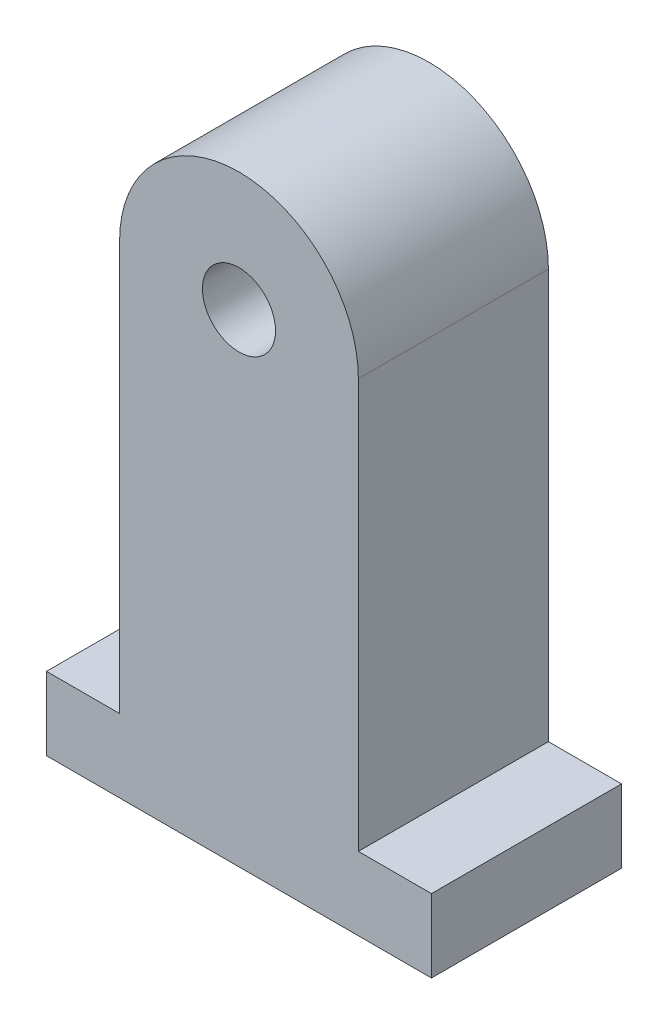
ISO-10303-21;
HEADER;
FILE_DESCRIPTION(('STEP AP214'),'2;1');
FILE_NAME('part.step','',(''),(''),'','','');
FILE_SCHEMA(('AUTOMOTIVE_DESIGN { 1 0 10303 214 1 1 1 1 }'));
ENDSEC;
DATA;
#1=APPLICATION_CONTEXT('core data for automotive mechanical design processes');
#2=APPLICATION_PROTOCOL_DEFINITION('international standard','automotive_design',2000,#1);
#3=PRODUCT_CONTEXT('',#1,'mechanical');
#4=PRODUCT('Part','Part','',(#3));
#5=PRODUCT_RELATED_PRODUCT_CATEGORY('part','',(#4));
#6=PRODUCT_DEFINITION_FORMATION('','',#4);
#7=PRODUCT_DEFINITION_CONTEXT('part definition',#1,'design');
#8=PRODUCT_DEFINITION('design','',#6,#7);
#9=PRODUCT_DEFINITION_SHAPE('','',#8);
#10=(LENGTH_UNIT() NAMED_UNIT(*) SI_UNIT(.MILLI.,.METRE.));
#11=(NAMED_UNIT(*) PLANE_ANGLE_UNIT() SI_UNIT($,.RADIAN.));
#12=(NAMED_UNIT(*) SI_UNIT($,.STERADIAN.) SOLID_ANGLE_UNIT());
#13=UNCERTAINTY_MEASURE_WITH_UNIT(LENGTH_MEASURE(1.E-05),#10,'distance_accuracy_value','');
#14=(GEOMETRIC_REPRESENTATION_CONTEXT(3) GLOBAL_UNCERTAINTY_ASSIGNED_CONTEXT((#13)) GLOBAL_UNIT_ASSIGNED_CONTEXT((#10,
#11,#12)) REPRESENTATION_CONTEXT('',''));
#15=CARTESIAN_POINT('',(0.,0.,0.));
#16=DIRECTION('',(0.,0.,1.));
#17=DIRECTION('',(1.,0.,0.));
#18=AXIS2_PLACEMENT_3D('',#15,#16,#17);
#19=CARTESIAN_POINT('',(0.,25.146,4.953));
#20=DIRECTION('',(0.,0.,-1.));
#21=DIRECTION('',(-1.,0.,0.));
#22=AXIS2_PLACEMENT_3D('',#19,#20,#21);
#23=PLANE('',#22);
#24=DIRECTION('',(0.,-1.,0.));
#25=VECTOR('',#24,1.);
#26=CARTESIAN_POINT('',(-10.033,0.,4.953));
#27=LINE('',#26,#25);
#28=CARTESIAN_POINT('',(-10.033,3.81,4.953));
#29=VERTEX_POINT('',#28);
#30=CARTESIAN_POINT('',(-10.033,0.,4.953));
#31=VERTEX_POINT('',#30);
#32=EDGE_CURVE('E149',#29,#31,#27,.T.);
#33=ORIENTED_EDGE('',*,*,#32,.T.);
#34=DIRECTION('',(1.,0.,0.));
#35=VECTOR('',#34,1.);
#36=CARTESIAN_POINT('',(10.033,0.,4.953));
#37=LINE('',#36,#35);
#38=CARTESIAN_POINT('',(10.033,0.,4.953));
#39=VERTEX_POINT('',#38);
#40=EDGE_CURVE('E97',#31,#39,#37,.T.);
#41=ORIENTED_EDGE('',*,*,#40,.T.);
#42=DIRECTION('',(0.,1.,0.));
#43=VECTOR('',#42,1.);
#44=CARTESIAN_POINT('',(10.033,0.,4.953));
#45=LINE('',#44,#43);
#46=CARTESIAN_POINT('',(10.033,3.81,4.953));
#47=VERTEX_POINT('',#46);
#48=EDGE_CURVE('E164',#39,#47,#45,.T.);
#49=ORIENTED_EDGE('',*,*,#48,.T.);
#50=DIRECTION('',(-1.,0.,0.));
#51=VECTOR('',#50,1.);
#52=CARTESIAN_POINT('',(10.033,3.81,4.953));
#53=LINE('',#52,#51);
#54=CARTESIAN_POINT('',(6.223,3.81,4.953));
#55=VERTEX_POINT('',#54);
#56=EDGE_CURVE('E177',#47,#55,#53,.T.);
#57=ORIENTED_EDGE('',*,*,#56,.T.);
#58=DIRECTION('',(0.,1.,0.));
#59=VECTOR('',#58,1.);
#60=CARTESIAN_POINT('',(6.223,3.81,4.953));
#61=LINE('',#60,#59);
#62=CARTESIAN_POINT('',(6.223,25.146,4.953));
#63=VERTEX_POINT('',#62);
#64=EDGE_CURVE('E116',#55,#63,#61,.T.);
#65=ORIENTED_EDGE('',*,*,#64,.T.);
#66=CARTESIAN_POINT('',(0.,25.146,4.953));
#67=DIRECTION('',(0.,0.,1.));
#68=DIRECTION('',(-1.,0.,0.));
#69=AXIS2_PLACEMENT_3D('',#66,#67,#68);
#70=CIRCLE('',#69,6.223);
#71=CARTESIAN_POINT('',(-6.223,25.146,4.953));
#72=VERTEX_POINT('',#71);
#73=EDGE_CURVE('E110',#63,#72,#70,.T.);
#74=ORIENTED_EDGE('',*,*,#73,.T.);
#75=DIRECTION('',(0.,-1.,0.));
#76=VECTOR('',#75,1.);
#77=CARTESIAN_POINT('',(-6.223,3.81,4.953));
#78=LINE('',#77,#76);
#79=CARTESIAN_POINT('',(-6.223,3.81,4.953));
#80=VERTEX_POINT('',#79);
#81=EDGE_CURVE('E114',#72,#80,#78,.T.);
#82=ORIENTED_EDGE('',*,*,#81,.T.);
#83=DIRECTION('',(-1.,0.,0.));
#84=VECTOR('',#83,1.);
#85=CARTESIAN_POINT('',(-10.033,3.81,4.953));
#86=LINE('',#85,#84);
#87=EDGE_CURVE('E54',#80,#29,#86,.T.);
#88=ORIENTED_EDGE('',*,*,#87,.T.);
#89=EDGE_LOOP('',(#33,#41,#49,#57,#65,#74,#82,#88));
#90=FACE_BOUND('',#89,.T.);
#91=CARTESIAN_POINT('',(0.,25.146,4.953));
#92=DIRECTION('',(0.,0.,1.));
#93=DIRECTION('',(1.,0.,0.));
#94=AXIS2_PLACEMENT_3D('',#91,#92,#93);
#95=CIRCLE('',#94,1.905);
#96=CARTESIAN_POINT('',(1.905,25.146,4.953));
#97=VERTEX_POINT('',#96);
#98=EDGE_CURVE('E138',#97,#97,#95,.T.);
#99=ORIENTED_EDGE('',*,*,#98,.F.);
#100=EDGE_LOOP('',(#99));
#101=FACE_BOUND('',#100,.T.);
#102=ADVANCED_FACE('F37',(#90,#101),#23,.F.);
#103=CARTESIAN_POINT('',(0.,25.146,-4.953));
#104=DIRECTION('',(0.,0.,-1.));
#105=DIRECTION('',(-1.,0.,0.));
#106=AXIS2_PLACEMENT_3D('',#103,#104,#105);
#107=PLANE('',#106);
#108=DIRECTION('',(0.,-1.,0.));
#109=VECTOR('',#108,1.);
#110=CARTESIAN_POINT('',(-10.033,0.,-4.953));
#111=LINE('',#110,#109);
#112=CARTESIAN_POINT('',(-10.033,3.81,-4.953));
#113=VERTEX_POINT('',#112);
#114=CARTESIAN_POINT('',(-10.033,0.,-4.953));
#115=VERTEX_POINT('',#114);
#116=EDGE_CURVE('E134',#113,#115,#111,.T.);
#117=ORIENTED_EDGE('',*,*,#116,.F.);
#118=DIRECTION('',(-1.,0.,0.));
#119=VECTOR('',#118,1.);
#120=CARTESIAN_POINT('',(-10.033,3.81,-4.953));
#121=LINE('',#120,#119);
#122=CARTESIAN_POINT('',(-6.223,3.81,-4.953));
#123=VERTEX_POINT('',#122);
#124=EDGE_CURVE('E89',#123,#113,#121,.T.);
#125=ORIENTED_EDGE('',*,*,#124,.F.);
#126=DIRECTION('',(0.,-1.,0.));
#127=VECTOR('',#126,1.);
#128=CARTESIAN_POINT('',(-6.223,3.81,-4.953));
#129=LINE('',#128,#127);
#130=CARTESIAN_POINT('',(-6.223,25.146,-4.953));
#131=VERTEX_POINT('',#130);
#132=EDGE_CURVE('E83',#131,#123,#129,.T.);
#133=ORIENTED_EDGE('',*,*,#132,.F.);
#134=CARTESIAN_POINT('',(0.,25.146,-4.953));
#135=DIRECTION('',(0.,0.,1.));
#136=DIRECTION('',(-1.,0.,0.));
#137=AXIS2_PLACEMENT_3D('',#134,#135,#136);
#138=CIRCLE('',#137,6.223);
#139=CARTESIAN_POINT('',(6.223,25.146,-4.953));
#140=VERTEX_POINT('',#139);
#141=EDGE_CURVE('E124',#140,#131,#138,.T.);
#142=ORIENTED_EDGE('',*,*,#141,.F.);
#143=DIRECTION('',(0.,1.,0.));
#144=VECTOR('',#143,1.);
#145=CARTESIAN_POINT('',(6.223,3.81,-4.953));
#146=LINE('',#145,#144);
#147=CARTESIAN_POINT('',(6.223,3.81,-4.953));
#148=VERTEX_POINT('',#147);
#149=EDGE_CURVE('E144',#148,#140,#146,.T.);
#150=ORIENTED_EDGE('',*,*,#149,.F.);
#151=DIRECTION('',(-1.,0.,0.));
#152=VECTOR('',#151,1.);
#153=CARTESIAN_POINT('',(10.033,3.81,-4.953));
#154=LINE('',#153,#152);
#155=CARTESIAN_POINT('',(10.033,3.81,-4.953));
#156=VERTEX_POINT('',#155);
#157=EDGE_CURVE('E142',#156,#148,#154,.T.);
#158=ORIENTED_EDGE('',*,*,#157,.F.);
#159=DIRECTION('',(0.,1.,0.));
#160=VECTOR('',#159,1.);
#161=CARTESIAN_POINT('',(10.033,0.,-4.953));
#162=LINE('',#161,#160);
#163=CARTESIAN_POINT('',(10.033,0.,-4.953));
#164=VERTEX_POINT('',#163);
#165=EDGE_CURVE('E140',#164,#156,#162,.T.);
#166=ORIENTED_EDGE('',*,*,#165,.F.);
#167=DIRECTION('',(1.,0.,0.));
#168=VECTOR('',#167,1.);
#169=CARTESIAN_POINT('',(10.033,0.,-4.953));
#170=LINE('',#169,#168);
#171=EDGE_CURVE('E137',#115,#164,#170,.T.);
#172=ORIENTED_EDGE('',*,*,#171,.F.);
#173=EDGE_LOOP('',(#117,#125,#133,#142,#150,#158,#166,#172));
#174=FACE_BOUND('',#173,.T.);
#175=CARTESIAN_POINT('',(0.,25.146,-4.953));
#176=DIRECTION('',(0.,0.,1.));
#177=DIRECTION('',(1.,0.,0.));
#178=AXIS2_PLACEMENT_3D('',#175,#176,#177);
#179=CIRCLE('',#178,1.905);
#180=CARTESIAN_POINT('',(1.905,25.146,-4.953));
#181=VERTEX_POINT('',#180);
#182=EDGE_CURVE('E183',#181,#181,#179,.T.);
#183=ORIENTED_EDGE('',*,*,#182,.T.);
#184=EDGE_LOOP('',(#183));
#185=FACE_BOUND('',#184,.T.);
#186=ADVANCED_FACE('F168',(#174,#185),#107,.T.);
#187=CARTESIAN_POINT('',(-10.033,0.,4.953));
#188=DIRECTION('',(1.,0.,0.));
#189=DIRECTION('',(0.,0.,-1.));
#190=AXIS2_PLACEMENT_3D('',#187,#188,#189);
#191=PLANE('',#190);
#192=ORIENTED_EDGE('',*,*,#116,.T.);
#193=DIRECTION('',(0.,0.,-1.));
#194=VECTOR('',#193,1.);
#195=CARTESIAN_POINT('',(-10.033,0.,4.953));
#196=LINE('',#195,#194);
#197=EDGE_CURVE('E11',#31,#115,#196,.T.);
#198=ORIENTED_EDGE('',*,*,#197,.F.);
#199=ORIENTED_EDGE('',*,*,#32,.F.);
#200=DIRECTION('',(0.,0.,-1.));
#201=VECTOR('',#200,1.);
#202=CARTESIAN_POINT('',(-10.033,3.81,4.953));
#203=LINE('',#202,#201);
#204=EDGE_CURVE('E130',#29,#113,#203,.T.);
#205=ORIENTED_EDGE('',*,*,#204,.T.);
#206=EDGE_LOOP('',(#192,#198,#199,#205));
#207=FACE_BOUND('',#206,.T.);
#208=ADVANCED_FACE('F39',(#207),#191,.F.);
#209=CARTESIAN_POINT('',(10.033,0.,4.953));
#210=DIRECTION('',(0.,1.,0.));
#211=DIRECTION('',(0.,0.,1.));
#212=AXIS2_PLACEMENT_3D('',#209,#210,#211);
#213=PLANE('',#212);
#214=ORIENTED_EDGE('',*,*,#171,.T.);
#215=DIRECTION('',(0.,0.,-1.));
#216=VECTOR('',#215,1.);
#217=CARTESIAN_POINT('',(10.033,0.,4.953));
#218=LINE('',#217,#216);
#219=EDGE_CURVE('E46',#39,#164,#218,.T.);
#220=ORIENTED_EDGE('',*,*,#219,.F.);
#221=ORIENTED_EDGE('',*,*,#40,.F.);
#222=ORIENTED_EDGE('',*,*,#197,.T.);
#223=EDGE_LOOP('',(#214,#220,#221,#222));
#224=FACE_BOUND('',#223,.T.);
#225=ADVANCED_FACE('F211',(#224),#213,.F.);
#226=CARTESIAN_POINT('',(10.033,0.,4.953));
#227=DIRECTION('',(-1.,0.,0.));
#228=DIRECTION('',(0.,0.,1.));
#229=AXIS2_PLACEMENT_3D('',#226,#227,#228);
#230=PLANE('',#229);
#231=ORIENTED_EDGE('',*,*,#165,.T.);
#232=DIRECTION('',(0.,0.,-1.));
#233=VECTOR('',#232,1.);
#234=CARTESIAN_POINT('',(10.033,3.81,4.953));
#235=LINE('',#234,#233);
#236=EDGE_CURVE('E156',#47,#156,#235,.T.);
#237=ORIENTED_EDGE('',*,*,#236,.F.);
#238=ORIENTED_EDGE('',*,*,#48,.F.);
#239=ORIENTED_EDGE('',*,*,#219,.T.);
#240=EDGE_LOOP('',(#231,#237,#238,#239));
#241=FACE_BOUND('',#240,.T.);
#242=ADVANCED_FACE('F162',(#241),#230,.F.);
#243=CARTESIAN_POINT('',(10.033,3.81,4.953));
#244=DIRECTION('',(0.,-1.,0.));
#245=DIRECTION('',(0.,0.,-1.));
#246=AXIS2_PLACEMENT_3D('',#243,#244,#245);
#247=PLANE('',#246);
#248=ORIENTED_EDGE('',*,*,#157,.T.);
#249=DIRECTION('',(0.,0.,-1.));
#250=VECTOR('',#249,1.);
#251=CARTESIAN_POINT('',(6.223,3.81,4.953));
#252=LINE('',#251,#250);
#253=EDGE_CURVE('E153',#55,#148,#252,.T.);
#254=ORIENTED_EDGE('',*,*,#253,.F.);
#255=ORIENTED_EDGE('',*,*,#56,.F.);
#256=ORIENTED_EDGE('',*,*,#236,.T.);
#257=EDGE_LOOP('',(#248,#254,#255,#256));
#258=FACE_BOUND('',#257,.T.);
#259=ADVANCED_FACE('F173',(#258),#247,.F.);
#260=CARTESIAN_POINT('',(6.223,3.81,4.953));
#261=DIRECTION('',(-1.,0.,0.));
#262=DIRECTION('',(0.,0.,1.));
#263=AXIS2_PLACEMENT_3D('',#260,#261,#262);
#264=PLANE('',#263);
#265=ORIENTED_EDGE('',*,*,#149,.T.);
#266=DIRECTION('',(0.,0.,-1.));
#267=VECTOR('',#266,1.);
#268=CARTESIAN_POINT('',(6.223,25.146,4.953));
#269=LINE('',#268,#267);
#270=EDGE_CURVE('E125',#63,#140,#269,.T.);
#271=ORIENTED_EDGE('',*,*,#270,.F.);
#272=ORIENTED_EDGE('',*,*,#64,.F.);
#273=ORIENTED_EDGE('',*,*,#253,.T.);
#274=EDGE_LOOP('',(#265,#271,#272,#273));
#275=FACE_BOUND('',#274,.T.);
#276=ADVANCED_FACE('F176',(#275),#264,.F.);
#277=CARTESIAN_POINT('',(0.,25.146,4.953));
#278=DIRECTION('',(0.,0.,-1.));
#279=DIRECTION('',(-1.,0.,0.));
#280=AXIS2_PLACEMENT_3D('',#277,#278,#279);
#281=CYLINDRICAL_SURFACE('',#280,6.223);
#282=ORIENTED_EDGE('',*,*,#141,.T.);
#283=DIRECTION('',(0.,0.,-1.));
#284=VECTOR('',#283,1.);
#285=CARTESIAN_POINT('',(-6.223,25.146,4.953));
#286=LINE('',#285,#284);
#287=EDGE_CURVE('E121',#72,#131,#286,.T.);
#288=ORIENTED_EDGE('',*,*,#287,.F.);
#289=ORIENTED_EDGE('',*,*,#73,.F.);
#290=ORIENTED_EDGE('',*,*,#270,.T.);
#291=EDGE_LOOP('',(#282,#288,#289,#290));
#292=FACE_BOUND('',#291,.T.);
#293=ADVANCED_FACE('F122',(#292),#281,.T.);
#294=CARTESIAN_POINT('',(-6.223,3.81,4.953));
#295=DIRECTION('',(1.,0.,0.));
#296=DIRECTION('',(0.,0.,-1.));
#297=AXIS2_PLACEMENT_3D('',#294,#295,#296);
#298=PLANE('',#297);
#299=ORIENTED_EDGE('',*,*,#132,.T.);
#300=DIRECTION('',(0.,0.,-1.));
#301=VECTOR('',#300,1.);
#302=CARTESIAN_POINT('',(-6.223,3.81,4.953));
#303=LINE('',#302,#301);
#304=EDGE_CURVE('E126',#80,#123,#303,.T.);
#305=ORIENTED_EDGE('',*,*,#304,.F.);
#306=ORIENTED_EDGE('',*,*,#81,.F.);
#307=ORIENTED_EDGE('',*,*,#287,.T.);
#308=EDGE_LOOP('',(#299,#305,#306,#307));
#309=FACE_BOUND('',#308,.T.);
#310=ADVANCED_FACE('F128',(#309),#298,.F.);
#311=CARTESIAN_POINT('',(-10.033,3.81,4.953));
#312=DIRECTION('',(0.,-1.,0.));
#313=DIRECTION('',(0.,0.,-1.));
#314=AXIS2_PLACEMENT_3D('',#311,#312,#313);
#315=PLANE('',#314);
#316=ORIENTED_EDGE('',*,*,#124,.T.);
#317=ORIENTED_EDGE('',*,*,#204,.F.);
#318=ORIENTED_EDGE('',*,*,#87,.F.);
#319=ORIENTED_EDGE('',*,*,#304,.T.);
#320=EDGE_LOOP('',(#316,#317,#318,#319));
#321=FACE_BOUND('',#320,.T.);
#322=ADVANCED_FACE('F199',(#321),#315,.F.);
#323=CARTESIAN_POINT('',(0.,25.146,4.953));
#324=DIRECTION('',(0.,0.,-1.));
#325=DIRECTION('',(-1.,0.,0.));
#326=AXIS2_PLACEMENT_3D('',#323,#324,#325);
#327=CYLINDRICAL_SURFACE('',#326,1.905);
#328=ORIENTED_EDGE('',*,*,#98,.T.);
#329=EDGE_LOOP('',(#328));
#330=FACE_BOUND('',#329,.T.);
#331=ORIENTED_EDGE('',*,*,#182,.F.);
#332=EDGE_LOOP('',(#331));
#333=FACE_BOUND('',#332,.T.);
#334=ADVANCED_FACE('F189',(#330,#333),#327,.F.);
#335=CLOSED_SHELL('',(#102,#186,#208,#225,#242,#259,#276,#293,#310,#322,#334));
#336=MANIFOLD_SOLID_BREP('B2',#335);
#337=ADVANCED_BREP_SHAPE_REPRESENTATION('',(#18,#336),#14);
#338=SHAPE_DEFINITION_REPRESENTATION(#9,#337);
ENDSEC;
END-ISO-10303-21;
